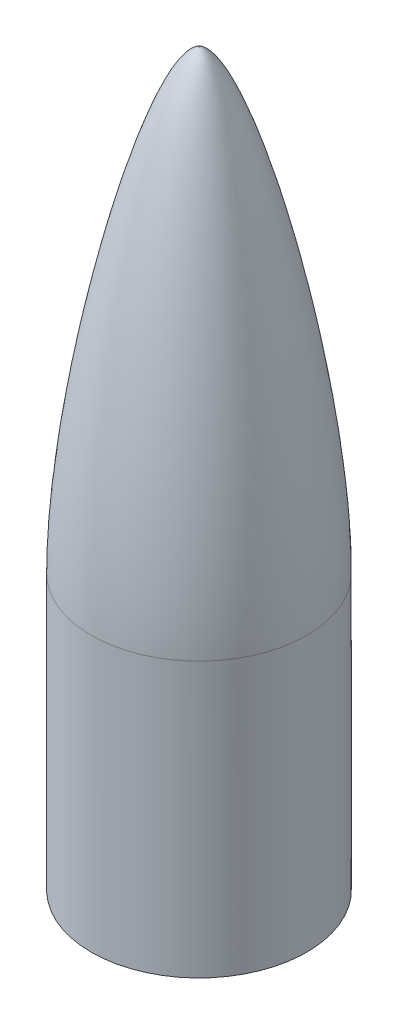
ISO-10303-21;
HEADER;
FILE_DESCRIPTION(('STEP AP214'),'2;1');
FILE_NAME('part.step','',(''),(''),'','','');
FILE_SCHEMA(('AUTOMOTIVE_DESIGN { 1 0 10303 214 1 1 1 1 }'));
ENDSEC;
DATA;
#1=APPLICATION_CONTEXT('core data for automotive mechanical design processes');
#2=APPLICATION_PROTOCOL_DEFINITION('international standard','automotive_design',2000,#1);
#3=PRODUCT_CONTEXT('',#1,'mechanical');
#4=PRODUCT('Part','Part','',(#3));
#5=PRODUCT_RELATED_PRODUCT_CATEGORY('part','',(#4));
#6=PRODUCT_DEFINITION_FORMATION('','',#4);
#7=PRODUCT_DEFINITION_CONTEXT('part definition',#1,'design');
#8=PRODUCT_DEFINITION('design','',#6,#7);
#9=PRODUCT_DEFINITION_SHAPE('','',#8);
#10=(LENGTH_UNIT() NAMED_UNIT(*) SI_UNIT(.MILLI.,.METRE.));
#11=(NAMED_UNIT(*) PLANE_ANGLE_UNIT() SI_UNIT($,.RADIAN.));
#12=(NAMED_UNIT(*) SI_UNIT($,.STERADIAN.) SOLID_ANGLE_UNIT());
#13=UNCERTAINTY_MEASURE_WITH_UNIT(LENGTH_MEASURE(1.E-05),#10,'distance_accuracy_value','');
#14=(GEOMETRIC_REPRESENTATION_CONTEXT(3) GLOBAL_UNCERTAINTY_ASSIGNED_CONTEXT((#13)) GLOBAL_UNIT_ASSIGNED_CONTEXT((#10,
#11,#12)) REPRESENTATION_CONTEXT('',''));
#15=CARTESIAN_POINT('',(0.,0.,0.));
#16=DIRECTION('',(0.,0.,1.));
#17=DIRECTION('',(1.,0.,0.));
#18=AXIS2_PLACEMENT_3D('',#15,#16,#17);
#19=CARTESIAN_POINT('',(2.85,0.,0.));
#20=DIRECTION('',(0.,-1.,0.));
#21=DIRECTION('',(0.,0.,-1.));
#22=AXIS2_PLACEMENT_3D('',#19,#20,#21);
#23=PLANE('',#22);
#24=CARTESIAN_POINT('',(0.,0.,0.));
#25=DIRECTION('',(0.,-1.,0.));
#26=DIRECTION('',(0.,0.,-1.));
#27=AXIS2_PLACEMENT_3D('',#24,#25,#26);
#28=CIRCLE('',#27,2.85);
#29=CARTESIAN_POINT('',(0.,0.,-2.85));
#30=VERTEX_POINT('',#29);
#31=EDGE_CURVE('E11',#30,#30,#28,.T.);
#32=ORIENTED_EDGE('',*,*,#31,.T.);
#33=EDGE_LOOP('',(#32));
#34=FACE_BOUND('',#33,.T.);
#35=ADVANCED_FACE('F33',(#34),#23,.T.);
#36=CARTESIAN_POINT('',(0.,0.,0.));
#37=DIRECTION('',(0.,-1.,0.));
#38=DIRECTION('',(0.,0.,-1.));
#39=AXIS2_PLACEMENT_3D('',#36,#37,#38);
#40=CYLINDRICAL_SURFACE('',#39,2.85);
#41=CARTESIAN_POINT('',(0.,7.25713799059815,0.));
#42=DIRECTION('',(0.,-1.,0.));
#43=DIRECTION('',(0.,0.,-1.));
#44=AXIS2_PLACEMENT_3D('',#41,#42,#43);
#45=CIRCLE('',#44,2.85);
#46=CARTESIAN_POINT('',(0.,7.25713799059815,-2.85));
#47=VERTEX_POINT('',#46);
#48=EDGE_CURVE('E39',#47,#47,#45,.T.);
#49=ORIENTED_EDGE('',*,*,#48,.T.);
#50=EDGE_LOOP('',(#49));
#51=FACE_BOUND('',#50,.T.);
#52=ORIENTED_EDGE('',*,*,#31,.F.);
#53=EDGE_LOOP('',(#52));
#54=FACE_BOUND('',#53,.T.);
#55=ADVANCED_FACE('F45',(#51,#54),#40,.T.);
#56=CARTESIAN_POINT('',(2.85,7.25713799059815,0.));
#57=CARTESIAN_POINT('',(2.85,11.5155035316873,0.));
#58=CARTESIAN_POINT('',(1.01795002946917,19.1228634137358,0.));
#59=CARTESIAN_POINT('',(0.,19.3,0.));
#60=B_SPLINE_CURVE_WITH_KNOTS('',3,(#56,#57,#58,#59),.UNSPECIFIED.,.F.,.F.,(4,4),(0.,1.),.UNSPECIFIED.);
#61=CARTESIAN_POINT('',(0.,0.,0.));
#62=DIRECTION('',(0.,-1.,0.));
#63=AXIS1_PLACEMENT('',#61,#62);
#64=SURFACE_OF_REVOLUTION('',#60,#63);
#65=CARTESIAN_POINT('',(0.,19.3,0.));
#66=VERTEX_POINT('',#65);
#67=VERTEX_LOOP('',#66);
#68=FACE_BOUND('',#67,.T.);
#69=ORIENTED_EDGE('',*,*,#48,.F.);
#70=EDGE_LOOP('',(#69));
#71=FACE_BOUND('',#70,.T.);
#72=ADVANCED_FACE('F42',(#68,#71),#64,.F.);
#73=CLOSED_SHELL('',(#35,#55,#72));
#74=MANIFOLD_SOLID_BREP('B2',#73);
#75=ADVANCED_BREP_SHAPE_REPRESENTATION('',(#18,#74),#14);
#76=SHAPE_DEFINITION_REPRESENTATION(#9,#75);
ENDSEC;
END-ISO-10303-21;
